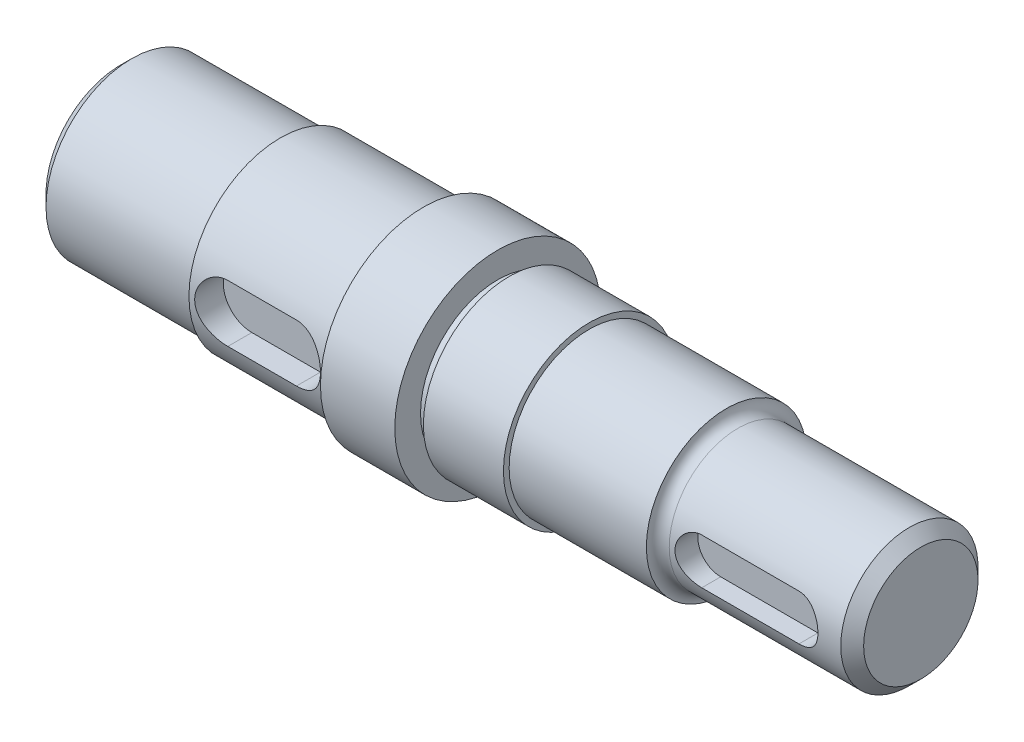
ISO-10303-21;
HEADER;
FILE_DESCRIPTION(('STEP AP214'),'2;1');
FILE_NAME('part.step','',(''),(''),'','','');
FILE_SCHEMA(('AUTOMOTIVE_DESIGN { 1 0 10303 214 1 1 1 1 }'));
ENDSEC;
DATA;
#1=APPLICATION_CONTEXT('core data for automotive mechanical design processes');
#2=APPLICATION_PROTOCOL_DEFINITION('international standard','automotive_design',2000,#1);
#3=PRODUCT_CONTEXT('',#1,'mechanical');
#4=PRODUCT('Part','Part','',(#3));
#5=PRODUCT_RELATED_PRODUCT_CATEGORY('part','',(#4));
#6=PRODUCT_DEFINITION_FORMATION('','',#4);
#7=PRODUCT_DEFINITION_CONTEXT('part definition',#1,'design');
#8=PRODUCT_DEFINITION('design','',#6,#7);
#9=PRODUCT_DEFINITION_SHAPE('','',#8);
#10=(LENGTH_UNIT() NAMED_UNIT(*) SI_UNIT(.MILLI.,.METRE.));
#11=(NAMED_UNIT(*) PLANE_ANGLE_UNIT() SI_UNIT($,.RADIAN.));
#12=(NAMED_UNIT(*) SI_UNIT($,.STERADIAN.) SOLID_ANGLE_UNIT());
#13=UNCERTAINTY_MEASURE_WITH_UNIT(LENGTH_MEASURE(1.E-05),#10,'distance_accuracy_value','');
#14=(GEOMETRIC_REPRESENTATION_CONTEXT(3) GLOBAL_UNCERTAINTY_ASSIGNED_CONTEXT((#13)) GLOBAL_UNIT_ASSIGNED_CONTEXT((#10,
#11,#12)) REPRESENTATION_CONTEXT('',''));
#15=CARTESIAN_POINT('',(0.,0.,0.));
#16=DIRECTION('',(0.,0.,1.));
#17=DIRECTION('',(1.,0.,0.));
#18=AXIS2_PLACEMENT_3D('',#15,#16,#17);
#19=CARTESIAN_POINT('',(0.,0.,0.));
#20=DIRECTION('',(1.,0.,0.));
#21=DIRECTION('',(0.,0.,-1.));
#22=AXIS2_PLACEMENT_3D('',#19,#20,#21);
#23=PLANE('',#22);
#24=CARTESIAN_POINT('',(0.,0.,0.));
#25=DIRECTION('',(1.,0.,0.));
#26=DIRECTION('',(0.,0.,-1.));
#27=AXIS2_PLACEMENT_3D('',#24,#25,#26);
#28=CIRCLE('',#27,13.);
#29=CARTESIAN_POINT('',(0.,0.,-13.));
#30=VERTEX_POINT('',#29);
#31=EDGE_CURVE('E294',#30,#30,#28,.F.);
#32=ORIENTED_EDGE('',*,*,#31,.T.);
#33=EDGE_LOOP('',(#32));
#34=FACE_BOUND('',#33,.T.);
#35=ADVANCED_FACE('F45',(#34),#23,.F.);
#36=CARTESIAN_POINT('',(0.,0.,0.));
#37=DIRECTION('',(-1.,0.,0.));
#38=DIRECTION('',(0.,0.,1.));
#39=AXIS2_PLACEMENT_3D('',#36,#37,#38);
#40=CYLINDRICAL_SURFACE('',#39,15.);
#41=CARTESIAN_POINT('',(2.00000000000004,0.,0.));
#42=DIRECTION('',(1.,0.,0.));
#43=DIRECTION('',(0.,0.,-1.));
#44=AXIS2_PLACEMENT_3D('',#41,#42,#43);
#45=CIRCLE('',#44,15.);
#46=CARTESIAN_POINT('',(2.00000000000004,0.,-15.));
#47=VERTEX_POINT('',#46);
#48=EDGE_CURVE('E298',#47,#47,#45,.T.);
#49=ORIENTED_EDGE('',*,*,#48,.T.);
#50=EDGE_LOOP('',(#49));
#51=FACE_BOUND('',#50,.T.);
#52=CARTESIAN_POINT('',(28.,0.,0.));
#53=DIRECTION('',(-1.,0.,0.));
#54=DIRECTION('',(0.,0.,1.));
#55=AXIS2_PLACEMENT_3D('',#52,#53,#54);
#56=CIRCLE('',#55,15.);
#57=CARTESIAN_POINT('',(28.,0.,15.));
#58=VERTEX_POINT('',#57);
#59=EDGE_CURVE('E208',#58,#58,#56,.T.);
#60=ORIENTED_EDGE('',*,*,#59,.T.);
#61=EDGE_LOOP('',(#60));
#62=FACE_BOUND('',#61,.T.);
#63=ADVANCED_FACE('F387',(#51,#62),#40,.T.);
#64=CARTESIAN_POINT('',(28.,15.,0.));
#65=DIRECTION('',(1.,0.,0.));
#66=DIRECTION('',(0.,0.,-1.));
#67=AXIS2_PLACEMENT_3D('',#64,#65,#66);
#68=PLANE('',#67);
#69=ORIENTED_EDGE('',*,*,#59,.F.);
#70=EDGE_LOOP('',(#69));
#71=FACE_BOUND('',#70,.T.);
#72=CARTESIAN_POINT('',(28.,0.,0.));
#73=DIRECTION('',(-1.,0.,0.));
#74=DIRECTION('',(0.,0.,1.));
#75=AXIS2_PLACEMENT_3D('',#72,#73,#74);
#76=CIRCLE('',#75,16.);
#77=CARTESIAN_POINT('',(28.,0.,16.));
#78=VERTEX_POINT('',#77);
#79=EDGE_CURVE('E204',#78,#78,#76,.T.);
#80=ORIENTED_EDGE('',*,*,#79,.T.);
#81=EDGE_LOOP('',(#80));
#82=FACE_BOUND('',#81,.T.);
#83=ADVANCED_FACE('F393',(#71,#82),#68,.F.);
#84=CARTESIAN_POINT('',(0.,0.,0.));
#85=DIRECTION('',(-1.,0.,0.));
#86=DIRECTION('',(0.,0.,1.));
#87=AXIS2_PLACEMENT_3D('',#84,#85,#86);
#88=CYLINDRICAL_SURFACE('',#87,16.);
#89=DIRECTION('',(-1.,0.,0.));
#90=VECTOR('',#89,1.);
#91=CARTESIAN_POINT('',(0.,-5.,15.1986841535707));
#92=LINE('',#91,#90);
#93=CARTESIAN_POINT('',(46.,-5.,15.1986841535706));
#94=VERTEX_POINT('',#93);
#95=CARTESIAN_POINT('',(34.,-5.,15.1986841535707));
#96=VERTEX_POINT('',#95);
#97=EDGE_CURVE('E130',#94,#96,#92,.T.);
#98=ORIENTED_EDGE('',*,*,#97,.T.);
#99=CARTESIAN_POINT('',(34.,-5.,15.1986841535707));
#100=CARTESIAN_POINT('',(33.8630702822621,-5.00001876402018,15.1986635060155));
#101=CARTESIAN_POINT('',(33.7261484213893,-4.99437589347759,15.2005339376472));
#102=CARTESIAN_POINT('',(33.4533558383189,-4.9719066012981,15.2079058985265));
#103=CARTESIAN_POINT('',(33.317484870769,-4.95508287500205,15.2134065526432));
#104=CARTESIAN_POINT('',(33.0481243746701,-4.91045141983463,15.2278686056186));
#105=CARTESIAN_POINT('',(32.9146294347407,-4.88267328245064,15.2368206796073));
#106=CARTESIAN_POINT('',(32.6505878086342,-4.81639022533697,15.2579029145887));
#107=CARTESIAN_POINT('',(32.520041210219,-4.77788498675235,15.2700331700498));
#108=CARTESIAN_POINT('',(32.2628612643995,-4.69049837729811,15.2971014107057));
#109=CARTESIAN_POINT('',(32.1362253650484,-4.64162394412445,15.3120375178334));
#110=CARTESIAN_POINT('',(31.8875769745497,-4.5338788859812,15.3442856115609));
#111=CARTESIAN_POINT('',(31.7655662261565,-4.47500453795589,15.3615984825888));
#112=CARTESIAN_POINT('',(31.4076109320201,-4.28398711580932,15.4163884767029));
#113=CARTESIAN_POINT('',(31.1796083142096,-4.13740351463561,15.4567319869187));
#114=CARTESIAN_POINT('',(30.7440479172172,-3.80477014396879,15.5420083062615));
#115=CARTESIAN_POINT('',(30.5373414917238,-3.61763914961479,15.5870445200358));
#116=CARTESIAN_POINT('',(30.1576323473106,-3.21145982301368,15.6757673694125));
#117=CARTESIAN_POINT('',(29.9846354272766,-2.99240601054465,15.7194537717275));
#118=CARTESIAN_POINT('',(29.6735496021778,-2.52249761762139,15.8017432610087));
#119=CARTESIAN_POINT('',(29.5363388732035,-2.27103576512449,15.8402090039263));
#120=CARTESIAN_POINT('',(29.3064928618221,-1.74720631304677,15.9065031203034));
#121=CARTESIAN_POINT('',(29.2138453184526,-1.47484448775403,15.9343344192537));
#122=CARTESIAN_POINT('',(29.078595976993,-0.925860089211058,15.9754868433124));
#123=CARTESIAN_POINT('',(29.0345378909618,-0.649628435012783,15.989229278753));
#124=CARTESIAN_POINT('',(28.9931025685312,-0.0933690149137269,16.0021438524195));
#125=CARTESIAN_POINT('',(28.9957156674186,0.186657953048518,16.0013190072522));
#126=CARTESIAN_POINT('',(29.0465934760002,0.732299589546373,15.9854845726588));
#127=CARTESIAN_POINT('',(29.0932787302122,0.998078033880897,15.9709657627342));
#128=CARTESIAN_POINT('',(29.2283803171704,1.5178147316323,15.9299791073477));
#129=CARTESIAN_POINT('',(29.3167988934806,1.77177234876052,15.90351061948));
#130=CARTESIAN_POINT('',(29.5338838261577,2.26431537219271,15.8409378140145));
#131=CARTESIAN_POINT('',(29.6630299628918,2.50267435181535,15.8047194262738));
#132=CARTESIAN_POINT('',(29.9574767783085,2.95480608942298,15.7264700104951));
#133=CARTESIAN_POINT('',(30.1227862195434,3.16857286940455,15.6844375745929));
#134=CARTESIAN_POINT('',(30.4931136677204,3.57495597883694,15.5969449434458));
#135=CARTESIAN_POINT('',(30.6994970743712,3.76632311133058,15.5514148920094));
#136=CARTESIAN_POINT('',(31.0310256265811,4.0255398962626,15.4855747041344));
#137=CARTESIAN_POINT('',(31.1452803226717,4.10735324144971,15.464023127535));
#138=CARTESIAN_POINT('',(31.3804385781784,4.26117389729569,15.4223452821405));
#139=CARTESIAN_POINT('',(31.5013395150757,4.33318503733555,15.4022184582275));
#140=CARTESIAN_POINT('',(31.7505332253631,4.46768370741089,15.3637482945825));
#141=CARTESIAN_POINT('',(31.8788980184553,4.53004475183006,15.3454296242414));
#142=CARTESIAN_POINT('',(32.1407366018309,4.64365087484838,15.3114343470153));
#143=CARTESIAN_POINT('',(32.2742082620061,4.69490052987992,15.2957566529907));
#144=CARTESIAN_POINT('',(32.5452079181555,4.78581076137361,15.2675565411669));
#145=CARTESIAN_POINT('',(32.6827314263573,4.82548366541208,15.2550307689955));
#146=CARTESIAN_POINT('',(32.960881366584,4.89292357731495,15.2335336556112));
#147=CARTESIAN_POINT('',(33.1015063415504,4.92069605575214,15.2245606813372));
#148=CARTESIAN_POINT('',(33.3683130663014,4.96155201839676,15.2112927618778));
#149=CARTESIAN_POINT('',(33.4942713191738,4.97596872830391,15.2065749583153));
#150=CARTESIAN_POINT('',(33.7468165151434,4.99519230047639,15.2002655216957));
#151=CARTESIAN_POINT('',(33.8734023162775,5.00001273345967,15.1986694740171));
#152=CARTESIAN_POINT('',(34.,5.,15.1986841535707));
#153=B_SPLINE_CURVE_WITH_KNOTS('',3,(#99,#100,#101,#102,#103,#104,#105,#106,#107,#108,#109,#110,
#111,#112,#113,#114,#115,#116,#117,#118,#119,#120,#121,#122,#123,#124,#125,#126,#127,#128,#129,
#130,#131,#132,#133,#134,#135,#136,#137,#138,#139,#140,#141,#142,#143,#144,#145,#146,#147,#148,
#149,#150,#151,#152),.UNSPECIFIED.,.F.,.F.,(4,2,2,2,2,2,2,2,2,2,2,2,2,2,2,2,2,2,2,2,2,2,2,2,2,2,
4),(0.,0.410647919758036,0.821196881542661,1.23064432922751,1.6401039487254,2.04929047101912,
2.45862967230993,3.27688279131029,4.12046514534439,4.96419248897057,5.82700574327197,
6.68958147010308,7.5255360051732,8.36131743199137,9.16823951381224,9.97520498033129,
10.7920560572179,11.609105280929,12.4601312020614,12.8862315051731,13.3121648650027,
13.7432787284905,14.174214690975,14.604690079864,15.0349673682784,15.4151752920152,
15.7948451560185),.UNSPECIFIED.);
#154=CARTESIAN_POINT('',(34.,5.,15.1986841535706));
#155=VERTEX_POINT('',#154);
#156=EDGE_CURVE('E286',#96,#155,#153,.T.);
#157=ORIENTED_EDGE('',*,*,#156,.T.);
#158=DIRECTION('',(-1.,0.,0.));
#159=VECTOR('',#158,1.);
#160=CARTESIAN_POINT('',(0.,5.,15.1986841535707));
#161=LINE('',#160,#159);
#162=CARTESIAN_POINT('',(46.,5.,15.1986841535707));
#163=VERTEX_POINT('',#162);
#164=EDGE_CURVE('E268',#155,#163,#161,.F.);
#165=ORIENTED_EDGE('',*,*,#164,.T.);
#166=CARTESIAN_POINT('',(46.,5.,15.1986841535707));
#167=CARTESIAN_POINT('',(46.1369297177379,5.00001876402018,15.1986635060155));
#168=CARTESIAN_POINT('',(46.2738515786107,4.99437589347759,15.2005339376472));
#169=CARTESIAN_POINT('',(46.5466441616812,4.9719066012981,15.2079058985265));
#170=CARTESIAN_POINT('',(46.6825151292311,4.95508287500205,15.2134065526432));
#171=CARTESIAN_POINT('',(46.95187562533,4.91045141983463,15.2278686056186));
#172=CARTESIAN_POINT('',(47.0853705652593,4.88267328245064,15.2368206796073));
#173=CARTESIAN_POINT('',(47.3494121913658,4.81639022533697,15.2579029145887));
#174=CARTESIAN_POINT('',(47.479958789781,4.77788498675235,15.2700331700498));
#175=CARTESIAN_POINT('',(47.7371387356005,4.6904983772981,15.2971014107057));
#176=CARTESIAN_POINT('',(47.8637746349516,4.64162394412444,15.3120375178334));
#177=CARTESIAN_POINT('',(48.1124230254503,4.53387888598119,15.3442856115609));
#178=CARTESIAN_POINT('',(48.2344337738436,4.47500453795589,15.3615984825888));
#179=CARTESIAN_POINT('',(48.5923890679799,4.28398711580932,15.4163884767029));
#180=CARTESIAN_POINT('',(48.8203916857905,4.13740351463561,15.4567319869187));
#181=CARTESIAN_POINT('',(49.2559520827829,3.80477014396878,15.5420083062615));
#182=CARTESIAN_POINT('',(49.4626585082763,3.61763914961478,15.5870445200358));
#183=CARTESIAN_POINT('',(49.8423676526895,3.21145982301367,15.6757673694125));
#184=CARTESIAN_POINT('',(50.0153645727234,2.99240601054464,15.7194537717275));
#185=CARTESIAN_POINT('',(50.3264503978223,2.52249761762139,15.8017432610087));
#186=CARTESIAN_POINT('',(50.4636611267965,2.27103576512448,15.8402090039263));
#187=CARTESIAN_POINT('',(50.6935071381779,1.74720631304676,15.9065031203034));
#188=CARTESIAN_POINT('',(50.7861546815474,1.47484448775402,15.9343344192537));
#189=CARTESIAN_POINT('',(50.9214040230071,0.925860089211045,15.9754868433124));
#190=CARTESIAN_POINT('',(50.9654621090383,0.64962843501277,15.989229278753));
#191=CARTESIAN_POINT('',(51.0068974314688,0.093369014913714,16.0021438524195));
#192=CARTESIAN_POINT('',(51.0042843325814,-0.18665795304853,16.0013190072522));
#193=CARTESIAN_POINT('',(50.9534065239999,-0.732299589546384,15.9854845726588));
#194=CARTESIAN_POINT('',(50.9067212697879,-0.998078033880907,15.9709657627342));
#195=CARTESIAN_POINT('',(50.7716196828297,-1.51781473163231,15.9299791073477));
#196=CARTESIAN_POINT('',(50.6832011065195,-1.77177234876053,15.90351061948));
#197=CARTESIAN_POINT('',(50.4661161738423,-2.26431537219272,15.8409378140145));
#198=CARTESIAN_POINT('',(50.3369700371082,-2.50267435181537,15.8047194262738));
#199=CARTESIAN_POINT('',(50.0425232216915,-2.954806089423,15.7264700104951));
#200=CARTESIAN_POINT('',(49.8772137804566,-3.16857286940456,15.6844375745929));
#201=CARTESIAN_POINT('',(49.5068863322796,-3.57495597883695,15.5969449434458));
#202=CARTESIAN_POINT('',(49.3005029256289,-3.76632311133059,15.5514148920094));
#203=CARTESIAN_POINT('',(48.9689743734189,-4.02553989626261,15.4855747041344));
#204=CARTESIAN_POINT('',(48.8547196773284,-4.10735324144972,15.464023127535));
#205=CARTESIAN_POINT('',(48.6195614218216,-4.2611738972957,15.4223452821405));
#206=CARTESIAN_POINT('',(48.4986604849244,-4.33318503733556,15.4022184582275));
#207=CARTESIAN_POINT('',(48.249466774637,-4.4676837074109,15.3637482945824));
#208=CARTESIAN_POINT('',(48.1211019815448,-4.53004475183006,15.3454296242414));
#209=CARTESIAN_POINT('',(47.8592633981691,-4.64365087484839,15.3114343470153));
#210=CARTESIAN_POINT('',(47.7257917379939,-4.69490052987993,15.2957566529907));
#211=CARTESIAN_POINT('',(47.4547920818445,-4.78581076137361,15.2675565411669));
#212=CARTESIAN_POINT('',(47.3172685736427,-4.82548366541208,15.2550307689955));
#213=CARTESIAN_POINT('',(47.039118633416,-4.89292357731495,15.2335336556112));
#214=CARTESIAN_POINT('',(46.8984936584496,-4.92069605575214,15.2245606813372));
#215=CARTESIAN_POINT('',(46.6316869336987,-4.96155201839676,15.2112927618778));
#216=CARTESIAN_POINT('',(46.5057286808263,-4.97596872830391,15.2065749583153));
#217=CARTESIAN_POINT('',(46.2531834848566,-4.99519230047639,15.2002655216957));
#218=CARTESIAN_POINT('',(46.1265976837226,-5.00001273345967,15.1986694740171));
#219=CARTESIAN_POINT('',(46.,-5.,15.1986841535707));
#220=B_SPLINE_CURVE_WITH_KNOTS('',3,(#166,#167,#168,#169,#170,#171,#172,#173,#174,#175,#176,
#177,#178,#179,#180,#181,#182,#183,#184,#185,#186,#187,#188,#189,#190,#191,#192,#193,#194,#195,
#196,#197,#198,#199,#200,#201,#202,#203,#204,#205,#206,#207,#208,#209,#210,#211,#212,#213,#214,
#215,#216,#217,#218,#219),.UNSPECIFIED.,.F.,.F.,(4,2,2,2,2,2,2,2,2,2,2,2,2,2,2,2,2,2,2,2,2,2,2,
2,2,2,4),(0.,0.410647919758036,0.821196881542661,1.23064432922751,1.64010394872541,
2.04929047101912,2.45862967230994,3.2768827913103,4.1204651453444,4.96419248897057,
5.82700574327198,6.6895814701031,7.52553600517322,8.36131743199138,9.16823951381225,
9.97520498033131,10.7920560572179,11.609105280929,12.4601312020614,12.8862315051731,
13.3121648650028,13.7432787284905,14.1742146909751,14.6046900798641,15.0349673682784,
15.4151752920152,15.7948451560185),.UNSPECIFIED.);
#221=EDGE_CURVE('E259',#163,#94,#220,.T.);
#222=ORIENTED_EDGE('',*,*,#221,.T.);
#223=EDGE_LOOP('',(#98,#157,#165,#222));
#224=FACE_BOUND('',#223,.T.);
#225=ORIENTED_EDGE('',*,*,#79,.F.);
#226=EDGE_LOOP('',(#225));
#227=FACE_BOUND('',#226,.T.);
#228=CARTESIAN_POINT('',(53.,0.,0.));
#229=DIRECTION('',(-1.,0.,0.));
#230=DIRECTION('',(0.,0.,1.));
#231=AXIS2_PLACEMENT_3D('',#228,#229,#230);
#232=CIRCLE('',#231,16.);
#233=CARTESIAN_POINT('',(53.,0.,16.));
#234=VERTEX_POINT('',#233);
#235=EDGE_CURVE('E200',#234,#234,#232,.T.);
#236=ORIENTED_EDGE('',*,*,#235,.T.);
#237=EDGE_LOOP('',(#236));
#238=FACE_BOUND('',#237,.T.);
#239=ADVANCED_FACE('F270',(#224,#227,#238),#88,.T.);
#240=CARTESIAN_POINT('',(53.,16.,0.));
#241=DIRECTION('',(1.,0.,0.));
#242=DIRECTION('',(0.,0.,-1.));
#243=AXIS2_PLACEMENT_3D('',#240,#241,#242);
#244=PLANE('',#243);
#245=ORIENTED_EDGE('',*,*,#235,.F.);
#246=EDGE_LOOP('',(#245));
#247=FACE_BOUND('',#246,.T.);
#248=CARTESIAN_POINT('',(53.,0.,0.));
#249=DIRECTION('',(-1.,0.,0.));
#250=DIRECTION('',(0.,0.,1.));
#251=AXIS2_PLACEMENT_3D('',#248,#249,#250);
#252=CIRCLE('',#251,18.);
#253=CARTESIAN_POINT('',(53.,0.,18.));
#254=VERTEX_POINT('',#253);
#255=EDGE_CURVE('E196',#254,#254,#252,.T.);
#256=ORIENTED_EDGE('',*,*,#255,.T.);
#257=EDGE_LOOP('',(#256));
#258=FACE_BOUND('',#257,.T.);
#259=ADVANCED_FACE('F413',(#247,#258),#244,.F.);
#260=CARTESIAN_POINT('',(0.,0.,0.));
#261=DIRECTION('',(-1.,0.,0.));
#262=DIRECTION('',(0.,0.,1.));
#263=AXIS2_PLACEMENT_3D('',#260,#261,#262);
#264=CYLINDRICAL_SURFACE('',#263,18.);
#265=ORIENTED_EDGE('',*,*,#255,.F.);
#266=EDGE_LOOP('',(#265));
#267=FACE_BOUND('',#266,.T.);
#268=CARTESIAN_POINT('',(66.,0.,0.));
#269=DIRECTION('',(-1.,0.,0.));
#270=DIRECTION('',(0.,0.,1.));
#271=AXIS2_PLACEMENT_3D('',#268,#269,#270);
#272=CIRCLE('',#271,18.);
#273=CARTESIAN_POINT('',(66.,0.,18.));
#274=VERTEX_POINT('',#273);
#275=EDGE_CURVE('E192',#274,#274,#272,.T.);
#276=ORIENTED_EDGE('',*,*,#275,.T.);
#277=EDGE_LOOP('',(#276));
#278=FACE_BOUND('',#277,.T.);
#279=ADVANCED_FACE('F418',(#267,#278),#264,.T.);
#280=CARTESIAN_POINT('',(66.,18.,0.));
#281=DIRECTION('',(-1.,0.,0.));
#282=DIRECTION('',(0.,0.,1.));
#283=AXIS2_PLACEMENT_3D('',#280,#281,#282);
#284=PLANE('',#283);
#285=ORIENTED_EDGE('',*,*,#275,.F.);
#286=EDGE_LOOP('',(#285));
#287=FACE_BOUND('',#286,.T.);
#288=CARTESIAN_POINT('',(66.,0.,0.));
#289=DIRECTION('',(-1.,0.,0.));
#290=DIRECTION('',(0.,0.,1.));
#291=AXIS2_PLACEMENT_3D('',#288,#289,#290);
#292=CIRCLE('',#291,13.5);
#293=CARTESIAN_POINT('',(66.,0.,13.5));
#294=VERTEX_POINT('',#293);
#295=EDGE_CURVE('E188',#294,#294,#292,.T.);
#296=ORIENTED_EDGE('',*,*,#295,.T.);
#297=EDGE_LOOP('',(#296));
#298=FACE_BOUND('',#297,.T.);
#299=ADVANCED_FACE('F423',(#287,#298),#284,.F.);
#300=CARTESIAN_POINT('',(0.,0.,0.));
#301=DIRECTION('',(-1.,0.,0.));
#302=DIRECTION('',(0.,0.,1.));
#303=AXIS2_PLACEMENT_3D('',#300,#301,#302);
#304=CYLINDRICAL_SURFACE('',#303,13.5);
#305=ORIENTED_EDGE('',*,*,#295,.F.);
#306=EDGE_LOOP('',(#305));
#307=FACE_BOUND('',#306,.T.);
#308=CARTESIAN_POINT('',(68.,0.,0.));
#309=DIRECTION('',(-1.,0.,0.));
#310=DIRECTION('',(0.,0.,1.));
#311=AXIS2_PLACEMENT_3D('',#308,#309,#310);
#312=CIRCLE('',#311,13.5);
#313=CARTESIAN_POINT('',(68.,0.,13.5));
#314=VERTEX_POINT('',#313);
#315=EDGE_CURVE('E184',#314,#314,#312,.T.);
#316=ORIENTED_EDGE('',*,*,#315,.T.);
#317=EDGE_LOOP('',(#316));
#318=FACE_BOUND('',#317,.T.);
#319=ADVANCED_FACE('F429',(#307,#318),#304,.T.);
#320=CARTESIAN_POINT('',(68.,13.5,0.));
#321=DIRECTION('',(1.,0.,0.));
#322=DIRECTION('',(0.,0.,-1.));
#323=AXIS2_PLACEMENT_3D('',#320,#321,#322);
#324=PLANE('',#323);
#325=ORIENTED_EDGE('',*,*,#315,.F.);
#326=EDGE_LOOP('',(#325));
#327=FACE_BOUND('',#326,.T.);
#328=CARTESIAN_POINT('',(68.,0.,0.));
#329=DIRECTION('',(-1.,0.,0.));
#330=DIRECTION('',(0.,0.,1.));
#331=AXIS2_PLACEMENT_3D('',#328,#329,#330);
#332=CIRCLE('',#331,15.);
#333=CARTESIAN_POINT('',(68.,0.,15.));
#334=VERTEX_POINT('',#333);
#335=EDGE_CURVE('E180',#334,#334,#332,.T.);
#336=ORIENTED_EDGE('',*,*,#335,.T.);
#337=EDGE_LOOP('',(#336));
#338=FACE_BOUND('',#337,.T.);
#339=ADVANCED_FACE('F435',(#327,#338),#324,.F.);
#340=CARTESIAN_POINT('',(0.,0.,0.));
#341=DIRECTION('',(-1.,0.,0.));
#342=DIRECTION('',(0.,0.,1.));
#343=AXIS2_PLACEMENT_3D('',#340,#341,#342);
#344=CYLINDRICAL_SURFACE('',#343,15.);
#345=ORIENTED_EDGE('',*,*,#335,.F.);
#346=EDGE_LOOP('',(#345));
#347=FACE_BOUND('',#346,.T.);
#348=CARTESIAN_POINT('',(82.,0.,0.));
#349=DIRECTION('',(-1.,0.,0.));
#350=DIRECTION('',(0.,0.,1.));
#351=AXIS2_PLACEMENT_3D('',#348,#349,#350);
#352=CIRCLE('',#351,15.);
#353=CARTESIAN_POINT('',(82.,0.,15.));
#354=VERTEX_POINT('',#353);
#355=EDGE_CURVE('E176',#354,#354,#352,.T.);
#356=ORIENTED_EDGE('',*,*,#355,.T.);
#357=EDGE_LOOP('',(#356));
#358=FACE_BOUND('',#357,.T.);
#359=ADVANCED_FACE('F441',(#347,#358),#344,.T.);
#360=CARTESIAN_POINT('',(82.,15.,0.));
#361=DIRECTION('',(-1.,0.,0.));
#362=DIRECTION('',(0.,0.,1.));
#363=AXIS2_PLACEMENT_3D('',#360,#361,#362);
#364=PLANE('',#363);
#365=ORIENTED_EDGE('',*,*,#355,.F.);
#366=EDGE_LOOP('',(#365));
#367=FACE_BOUND('',#366,.T.);
#368=CARTESIAN_POINT('',(82.,0.,0.));
#369=DIRECTION('',(-1.,0.,0.));
#370=DIRECTION('',(0.,0.,1.));
#371=AXIS2_PLACEMENT_3D('',#368,#369,#370);
#372=CIRCLE('',#371,14.);
#373=CARTESIAN_POINT('',(82.,0.,14.));
#374=VERTEX_POINT('',#373);
#375=EDGE_CURVE('E172',#374,#374,#372,.T.);
#376=ORIENTED_EDGE('',*,*,#375,.T.);
#377=EDGE_LOOP('',(#376));
#378=FACE_BOUND('',#377,.T.);
#379=ADVANCED_FACE('F447',(#367,#378),#364,.F.);
#380=CARTESIAN_POINT('',(0.,0.,0.));
#381=DIRECTION('',(-1.,0.,0.));
#382=DIRECTION('',(0.,0.,1.));
#383=AXIS2_PLACEMENT_3D('',#380,#381,#382);
#384=CYLINDRICAL_SURFACE('',#383,14.);
#385=ORIENTED_EDGE('',*,*,#375,.F.);
#386=EDGE_LOOP('',(#385));
#387=FACE_BOUND('',#386,.T.);
#388=CARTESIAN_POINT('',(106.,0.,0.));
#389=DIRECTION('',(-1.,0.,0.));
#390=DIRECTION('',(0.,0.,1.));
#391=AXIS2_PLACEMENT_3D('',#388,#389,#390);
#392=CIRCLE('',#391,14.);
#393=CARTESIAN_POINT('',(106.,0.,14.));
#394=VERTEX_POINT('',#393);
#395=EDGE_CURVE('E168',#394,#394,#392,.T.);
#396=ORIENTED_EDGE('',*,*,#395,.T.);
#397=EDGE_LOOP('',(#396));
#398=FACE_BOUND('',#397,.T.);
#399=ADVANCED_FACE('F319',(#387,#398),#384,.T.);
#400=CARTESIAN_POINT('',(0.,0.,0.));
#401=DIRECTION('',(-1.,0.,0.));
#402=DIRECTION('',(0.,0.,1.));
#403=AXIS2_PLACEMENT_3D('',#400,#401,#402);
#404=CYLINDRICAL_SURFACE('',#403,12.);
#405=CARTESIAN_POINT('',(108.,0.,0.));
#406=DIRECTION('',(-1.,0.,0.));
#407=DIRECTION('',(0.,0.,1.));
#408=AXIS2_PLACEMENT_3D('',#405,#406,#407);
#409=CIRCLE('',#408,12.);
#410=CARTESIAN_POINT('',(108.,0.,12.));
#411=VERTEX_POINT('',#410);
#412=EDGE_CURVE('E12',#411,#411,#409,.F.);
#413=ORIENTED_EDGE('',*,*,#412,.T.);
#414=EDGE_LOOP('',(#413));
#415=FACE_BOUND('',#414,.T.);
#416=CARTESIAN_POINT('',(138.,0.,0.));
#417=DIRECTION('',(-1.,0.,0.));
#418=DIRECTION('',(0.,0.,1.));
#419=AXIS2_PLACEMENT_3D('',#416,#417,#418);
#420=CIRCLE('',#419,12.);
#421=CARTESIAN_POINT('',(138.,0.,12.));
#422=VERTEX_POINT('',#421);
#423=EDGE_CURVE('E302',#422,#422,#420,.T.);
#424=ORIENTED_EDGE('',*,*,#423,.T.);
#425=EDGE_LOOP('',(#424));
#426=FACE_BOUND('',#425,.T.);
#427=DIRECTION('',(-1.,0.,0.));
#428=VECTOR('',#427,1.);
#429=CARTESIAN_POINT('',(0.,-4.0000000000001,11.3137084989847));
#430=LINE('',#429,#428);
#431=CARTESIAN_POINT('',(130.,-3.99999999999999,11.3137084989847));
#432=VERTEX_POINT('',#431);
#433=CARTESIAN_POINT('',(113.,-4.0000000000001,11.3137084989847));
#434=VERTEX_POINT('',#433);
#435=EDGE_CURVE('E212',#432,#434,#430,.T.);
#436=ORIENTED_EDGE('',*,*,#435,.T.);
#437=CARTESIAN_POINT('',(113.,-4.00000000000001,11.3137084989848));
#438=CARTESIAN_POINT('',(112.890868675487,-4.00001438576651,11.3136910923705));
#439=CARTESIAN_POINT('',(112.781747080519,-3.99553419554537,11.3152871024731));
#440=CARTESIAN_POINT('',(112.564350338641,-3.97769673248753,11.3215763859361));
#441=CARTESIAN_POINT('',(112.456074971219,-3.96434185595522,11.3262688232103));
#442=CARTESIAN_POINT('',(112.241455218633,-3.92891935076474,11.3386032840401));
#443=CARTESIAN_POINT('',(112.135106075919,-3.90687756421022,11.3462365576019));
#444=CARTESIAN_POINT('',(111.924786770268,-3.85430689648188,11.364201918496));
#445=CARTESIAN_POINT('',(111.820816693457,-3.82377770857634,11.3745341033652));
#446=CARTESIAN_POINT('',(111.513661472456,-3.71986482089948,11.4091190527027));
#447=CARTESIAN_POINT('',(111.314913348044,-3.63410266896587,11.4369799021453));
#448=CARTESIAN_POINT('',(110.934597101663,-3.43228454569821,11.4991525453998));
#449=CARTESIAN_POINT('',(110.753039622767,-3.31620997228937,11.5334682968154));
#450=CARTESIAN_POINT('',(110.405131354431,-3.05220793355649,11.6061789182336));
#451=CARTESIAN_POINT('',(110.239543771511,-2.90330055412141,11.6446750308563));
#452=CARTESIAN_POINT('',(109.935172634886,-2.57995313902011,11.7205540276094));
#453=CARTESIAN_POINT('',(109.796393854115,-2.40550856651356,11.7579367125094));
#454=CARTESIAN_POINT('',(109.546082840949,-2.03041476001126,11.8285552975691));
#455=CARTESIAN_POINT('',(109.435356306739,-1.82920040495823,11.8616574966305));
#456=CARTESIAN_POINT('',(109.249630748978,-1.40971695235372,11.9187843500282));
#457=CARTESIAN_POINT('',(109.174620811381,-1.19145308844236,11.9428117769099));
#458=CARTESIAN_POINT('',(109.065057154839,-0.752117395358864,11.9783628445804));
#459=CARTESIAN_POINT('',(109.029186914908,-0.531407346429905,11.9902923605184));
#460=CARTESIAN_POINT('',(108.994734800776,-0.0867958692352762,12.0017443351774));
#461=CARTESIAN_POINT('',(108.996144041613,0.13710478588682,12.0012697502156));
#462=CARTESIAN_POINT('',(109.035377095253,0.572415361032324,11.9882415502496));
#463=CARTESIAN_POINT('',(109.07177040133,0.783970739663763,11.9761624577266));
#464=CARTESIAN_POINT('',(109.177572945212,1.19777632834895,11.9418784019559));
#465=CARTESIAN_POINT('',(109.246984013727,1.40002602175551,11.9196728772387));
#466=CARTESIAN_POINT('',(109.41768490607,1.7926102253711,11.8670267992102));
#467=CARTESIAN_POINT('',(109.519382030606,1.98275302130578,11.8364817702071));
#468=CARTESIAN_POINT('',(109.751441956031,2.34369935797279,11.7703352504572));
#469=CARTESIAN_POINT('',(109.881812554588,2.51449761883745,11.7347323851811));
#470=CARTESIAN_POINT('',(110.174675792184,2.84038544309998,11.6602518814889));
#471=CARTESIAN_POINT('',(110.338390110299,2.99435951335509,11.6212989752184));
#472=CARTESIAN_POINT('',(110.689798033346,3.27310303719343,11.5458957896576));
#473=CARTESIAN_POINT('',(110.877499355,3.39786305574726,11.5094463215614));
#474=CARTESIAN_POINT('',(111.174712950377,3.56109757745216,11.4595759659792));
#475=CARTESIAN_POINT('',(111.277255404768,3.61182358389816,11.4436484943195));
#476=CARTESIAN_POINT('',(111.486564980956,3.70440095621128,11.4140167075143));
#477=CARTESIAN_POINT('',(111.593330322076,3.74625601636389,11.4003114674865));
#478=CARTESIAN_POINT('',(111.810217086566,3.82067426911566,11.3755873303494));
#479=CARTESIAN_POINT('',(111.920334713104,3.85324757051517,11.3645655126344));
#480=CARTESIAN_POINT('',(112.143168154447,3.90883841588792,11.3455648512893));
#481=CARTESIAN_POINT('',(112.255882757962,3.93186032329112,11.3375846182867));
#482=CARTESIAN_POINT('',(112.473642446551,3.96661962949784,11.3254693235584));
#483=CARTESIAN_POINT('',(112.578549519579,3.97913375141092,11.3210705251979));
#484=CARTESIAN_POINT('',(112.7889683327,3.99582494949883,11.3151843303776));
#485=CARTESIAN_POINT('',(112.894479115668,4.00001278362334,11.3136931771535));
#486=CARTESIAN_POINT('',(113.,4.00000000000001,11.3137084989848));
#487=B_SPLINE_CURVE_WITH_KNOTS('',3,(#437,#438,#439,#440,#441,#442,#443,#444,#445,#446,#447,
#448,#449,#450,#451,#452,#453,#454,#455,#456,#457,#458,#459,#460,#461,#462,#463,#464,#465,#466,
#467,#468,#469,#470,#471,#472,#473,#474,#475,#476,#477,#478,#479,#480,#481,#482,#483,#484,#485,
#486),.UNSPECIFIED.,.F.,.F.,(4,2,2,2,2,2,2,2,2,2,2,2,2,2,2,2,2,2,2,2,2,2,2,2,4),(0.,
0.327273938941734,0.654459544677852,0.980679087086539,1.30691042048863,1.95841627077209,
2.61032287944838,3.28524582541424,3.96028882145703,4.65295094423119,5.34540127175223,
6.01376445600326,6.68196834813284,7.32396236553655,7.96599198323706,8.61646637994585,
9.26711789045788,9.94834778922915,10.6297973968768,10.9759539762202,11.3219661149517,
11.6675999574416,12.0130757272824,12.3299368411189,12.6463882889711),.UNSPECIFIED.);
#488=CARTESIAN_POINT('',(113.,4.00000000000001,11.3137084989847));
#489=VERTEX_POINT('',#488);
#490=EDGE_CURVE('E249',#434,#489,#487,.T.);
#491=ORIENTED_EDGE('',*,*,#490,.T.);
#492=DIRECTION('',(-1.,0.,0.));
#493=VECTOR('',#492,1.);
#494=CARTESIAN_POINT('',(0.,4.0000000000001,11.3137084989847));
#495=LINE('',#494,#493);
#496=CARTESIAN_POINT('',(130.,3.99999999999999,11.3137084989848));
#497=VERTEX_POINT('',#496);
#498=EDGE_CURVE('E226',#489,#497,#495,.F.);
#499=ORIENTED_EDGE('',*,*,#498,.T.);
#500=CARTESIAN_POINT('',(130.,3.99999999999999,11.3137084989848));
#501=CARTESIAN_POINT('',(130.109131324513,4.00001438576649,11.3136910923705));
#502=CARTESIAN_POINT('',(130.218252919481,3.99553419554535,11.3152871024731));
#503=CARTESIAN_POINT('',(130.435649661359,3.97769673248751,11.3215763859361));
#504=CARTESIAN_POINT('',(130.543925028781,3.96434185595521,11.3262688232103));
#505=CARTESIAN_POINT('',(130.758544781367,3.92891935076473,11.3386032840401));
#506=CARTESIAN_POINT('',(130.864893924082,3.9068775642102,11.3462365576019));
#507=CARTESIAN_POINT('',(131.075213229732,3.85430689648187,11.364201918496));
#508=CARTESIAN_POINT('',(131.179183306543,3.82377770857633,11.3745341033652));
#509=CARTESIAN_POINT('',(131.486338527544,3.71986482089946,11.4091190527027));
#510=CARTESIAN_POINT('',(131.685086651956,3.63410266896586,11.4369799021453));
#511=CARTESIAN_POINT('',(132.065402898337,3.43228454569819,11.4991525453998));
#512=CARTESIAN_POINT('',(132.246960377233,3.31620997228935,11.5334682968154));
#513=CARTESIAN_POINT('',(132.594868645569,3.05220793355648,11.6061789182336));
#514=CARTESIAN_POINT('',(132.760456228489,2.9033005541214,11.6446750308563));
#515=CARTESIAN_POINT('',(133.064827365114,2.57995313902011,11.7205540276094));
#516=CARTESIAN_POINT('',(133.203606145885,2.40550856651357,11.7579367125094));
#517=CARTESIAN_POINT('',(133.453917159051,2.03041476001127,11.8285552975691));
#518=CARTESIAN_POINT('',(133.564643693261,1.82920040495825,11.8616574966305));
#519=CARTESIAN_POINT('',(133.750369251022,1.40971695235374,11.9187843500282));
#520=CARTESIAN_POINT('',(133.825379188619,1.19145308844236,11.9428117769099));
#521=CARTESIAN_POINT('',(133.934942845161,0.752117395358866,11.9783628445804));
#522=CARTESIAN_POINT('',(133.970813085092,0.531407346429908,11.9902923605184));
#523=CARTESIAN_POINT('',(134.005265199224,0.086795869235282,12.0017443351774));
#524=CARTESIAN_POINT('',(134.003855958387,-0.137104785886813,12.0012697502156));
#525=CARTESIAN_POINT('',(133.964622904747,-0.572415361032315,11.9882415502496));
#526=CARTESIAN_POINT('',(133.92822959867,-0.783970739663753,11.9761624577266));
#527=CARTESIAN_POINT('',(133.822427054788,-1.19777632834894,11.9418784019559));
#528=CARTESIAN_POINT('',(133.753015986273,-1.40002602175549,11.9196728772387));
#529=CARTESIAN_POINT('',(133.58231509393,-1.79261022537109,11.8670267992102));
#530=CARTESIAN_POINT('',(133.480617969394,-1.98275302130578,11.8364817702071));
#531=CARTESIAN_POINT('',(133.248558043969,-2.34369935797278,11.7703352504572));
#532=CARTESIAN_POINT('',(133.118187445412,-2.51449761883744,11.7347323851811));
#533=CARTESIAN_POINT('',(132.825324207816,-2.84038544309997,11.6602518814889));
#534=CARTESIAN_POINT('',(132.661609889701,-2.99435951335508,11.6212989752184));
#535=CARTESIAN_POINT('',(132.310201966654,-3.27310303719342,11.5458957896576));
#536=CARTESIAN_POINT('',(132.122500645,-3.39786305574724,11.5094463215614));
#537=CARTESIAN_POINT('',(131.825287049623,-3.56109757745214,11.4595759659792));
#538=CARTESIAN_POINT('',(131.722744595233,-3.61182358389813,11.4436484943195));
#539=CARTESIAN_POINT('',(131.513435019044,-3.70440095621126,11.4140167075143));
#540=CARTESIAN_POINT('',(131.406669677924,-3.74625601636387,11.4003114674865));
#541=CARTESIAN_POINT('',(131.189782913434,-3.82067426911564,11.3755873303494));
#542=CARTESIAN_POINT('',(131.079665286896,-3.85324757051515,11.3645655126344));
#543=CARTESIAN_POINT('',(130.856831845553,-3.90883841588791,11.3455648512893));
#544=CARTESIAN_POINT('',(130.744117242038,-3.93186032329111,11.3375846182867));
#545=CARTESIAN_POINT('',(130.526357553449,-3.96661962949783,11.3254693235584));
#546=CARTESIAN_POINT('',(130.421450480421,-3.97913375141091,11.3210705251979));
#547=CARTESIAN_POINT('',(130.2110316673,-3.99582494949882,11.3151843303776));
#548=CARTESIAN_POINT('',(130.105520884332,-4.00001278362332,11.3136931771535));
#549=CARTESIAN_POINT('',(130.,-3.99999999999999,11.3137084989848));
#550=B_SPLINE_CURVE_WITH_KNOTS('',3,(#500,#501,#502,#503,#504,#505,#506,#507,#508,#509,#510,
#511,#512,#513,#514,#515,#516,#517,#518,#519,#520,#521,#522,#523,#524,#525,#526,#527,#528,#529,
#530,#531,#532,#533,#534,#535,#536,#537,#538,#539,#540,#541,#542,#543,#544,#545,#546,#547,#548,
#549),.UNSPECIFIED.,.F.,.F.,(4,2,2,2,2,2,2,2,2,2,2,2,2,2,2,2,2,2,2,2,2,2,2,2,4),(0.,
0.327273938941734,0.654459544677866,0.980679087086552,1.30691042048862,1.95841627077209,
2.61032287944838,3.28524582541421,3.96028882145698,4.65295094423115,5.3454012717522,
6.01376445600323,6.68196834813281,7.32396236553652,7.96599198323703,8.61646637994583,
9.26711789045785,9.94834778922909,10.6297973968768,10.9759539762201,11.3219661149517,
11.6675999574416,12.0130757272824,12.3299368411189,12.6463882889711),.UNSPECIFIED.);
#551=EDGE_CURVE('E216',#497,#432,#550,.T.);
#552=ORIENTED_EDGE('',*,*,#551,.T.);
#553=EDGE_LOOP('',(#436,#491,#499,#552));
#554=FACE_BOUND('',#553,.T.);
#555=ADVANCED_FACE('F228',(#415,#426,#554),#404,.T.);
#556=CARTESIAN_POINT('',(140.,12.,0.));
#557=DIRECTION('',(-1.,0.,0.));
#558=DIRECTION('',(0.,0.,1.));
#559=AXIS2_PLACEMENT_3D('',#556,#557,#558);
#560=PLANE('',#559);
#561=CARTESIAN_POINT('',(140.,0.,0.));
#562=DIRECTION('',(-1.,0.,0.));
#563=DIRECTION('',(0.,0.,1.));
#564=AXIS2_PLACEMENT_3D('',#561,#562,#563);
#565=CIRCLE('',#564,9.99999999999999);
#566=CARTESIAN_POINT('',(140.,0.,9.99999999999999));
#567=VERTEX_POINT('',#566);
#568=EDGE_CURVE('E54',#567,#567,#565,.F.);
#569=ORIENTED_EDGE('',*,*,#568,.T.);
#570=EDGE_LOOP('',(#569));
#571=FACE_BOUND('',#570,.T.);
#572=ADVANCED_FACE('F247',(#571),#560,.F.);
#573=CARTESIAN_POINT('',(113.,0.,-26.2488094968134));
#574=DIRECTION('',(0.,0.,1.));
#575=DIRECTION('',(1.,0.,0.));
#576=AXIS2_PLACEMENT_3D('',#573,#574,#575);
#577=CYLINDRICAL_SURFACE('',#576,4.00000000000001);
#578=DIRECTION('',(0.,0.,1.));
#579=VECTOR('',#578,1.);
#580=CARTESIAN_POINT('',(113.,-4.00000000000001,-26.2488094968134));
#581=LINE('',#580,#579);
#582=CARTESIAN_POINT('',(113.,-4.00000000000001,8.));
#583=VERTEX_POINT('',#582);
#584=EDGE_CURVE('E69',#583,#434,#581,.T.);
#585=ORIENTED_EDGE('',*,*,#584,.F.);
#586=CARTESIAN_POINT('',(113.,0.,8.));
#587=DIRECTION('',(0.,0.,1.));
#588=DIRECTION('',(1.,0.,0.));
#589=AXIS2_PLACEMENT_3D('',#586,#587,#588);
#590=CIRCLE('',#589,4.00000000000001);
#591=CARTESIAN_POINT('',(113.,4.00000000000001,8.));
#592=VERTEX_POINT('',#591);
#593=EDGE_CURVE('E152',#583,#592,#590,.F.);
#594=ORIENTED_EDGE('',*,*,#593,.T.);
#595=DIRECTION('',(0.,0.,1.));
#596=VECTOR('',#595,1.);
#597=CARTESIAN_POINT('',(113.,4.00000000000001,-26.2488094968134));
#598=LINE('',#597,#596);
#599=EDGE_CURVE('E149',#592,#489,#598,.T.);
#600=ORIENTED_EDGE('',*,*,#599,.T.);
#601=ORIENTED_EDGE('',*,*,#490,.F.);
#602=EDGE_LOOP('',(#585,#594,#600,#601));
#603=FACE_BOUND('',#602,.T.);
#604=ADVANCED_FACE('F244',(#603),#577,.F.);
#605=CARTESIAN_POINT('',(113.,4.00000000000001,-26.2488094968134));
#606=DIRECTION('',(0.,1.,0.));
#607=DIRECTION('',(-1.,0.,0.));
#608=AXIS2_PLACEMENT_3D('',#605,#606,#607);
#609=PLANE('',#608);
#610=ORIENTED_EDGE('',*,*,#599,.F.);
#611=DIRECTION('',(1.,0.,0.));
#612=VECTOR('',#611,1.);
#613=CARTESIAN_POINT('',(113.,4.00000000000001,8.));
#614=LINE('',#613,#612);
#615=CARTESIAN_POINT('',(130.,3.99999999999999,8.));
#616=VERTEX_POINT('',#615);
#617=EDGE_CURVE('E148',#592,#616,#614,.T.);
#618=ORIENTED_EDGE('',*,*,#617,.T.);
#619=DIRECTION('',(0.,0.,1.));
#620=VECTOR('',#619,1.);
#621=CARTESIAN_POINT('',(130.,3.99999999999999,-26.2488094968134));
#622=LINE('',#621,#620);
#623=EDGE_CURVE('E159',#616,#497,#622,.T.);
#624=ORIENTED_EDGE('',*,*,#623,.T.);
#625=ORIENTED_EDGE('',*,*,#498,.F.);
#626=EDGE_LOOP('',(#610,#618,#624,#625));
#627=FACE_BOUND('',#626,.T.);
#628=ADVANCED_FACE('F238',(#627),#609,.F.);
#629=CARTESIAN_POINT('',(130.,0.,-26.2488094968134));
#630=DIRECTION('',(0.,0.,1.));
#631=DIRECTION('',(1.,0.,0.));
#632=AXIS2_PLACEMENT_3D('',#629,#630,#631);
#633=CYLINDRICAL_SURFACE('',#632,3.99999999999999);
#634=ORIENTED_EDGE('',*,*,#623,.F.);
#635=CARTESIAN_POINT('',(130.,0.,8.));
#636=DIRECTION('',(0.,0.,1.));
#637=DIRECTION('',(1.,0.,0.));
#638=AXIS2_PLACEMENT_3D('',#635,#636,#637);
#639=CIRCLE('',#638,3.99999999999999);
#640=CARTESIAN_POINT('',(130.,-3.99999999999999,8.));
#641=VERTEX_POINT('',#640);
#642=EDGE_CURVE('E145',#616,#641,#639,.F.);
#643=ORIENTED_EDGE('',*,*,#642,.T.);
#644=DIRECTION('',(0.,0.,1.));
#645=VECTOR('',#644,1.);
#646=CARTESIAN_POINT('',(130.,-3.99999999999999,-26.2488094968134));
#647=LINE('',#646,#645);
#648=EDGE_CURVE('E140',#641,#432,#647,.T.);
#649=ORIENTED_EDGE('',*,*,#648,.T.);
#650=ORIENTED_EDGE('',*,*,#551,.F.);
#651=EDGE_LOOP('',(#634,#643,#649,#650));
#652=FACE_BOUND('',#651,.T.);
#653=ADVANCED_FACE('F232',(#652),#633,.F.);
#654=CARTESIAN_POINT('',(113.,-4.00000000000001,-26.2488094968134));
#655=DIRECTION('',(0.,-1.,0.));
#656=DIRECTION('',(1.,0.,0.));
#657=AXIS2_PLACEMENT_3D('',#654,#655,#656);
#658=PLANE('',#657);
#659=ORIENTED_EDGE('',*,*,#648,.F.);
#660=DIRECTION('',(-1.,0.,0.));
#661=VECTOR('',#660,1.);
#662=CARTESIAN_POINT('',(113.,-4.00000000000001,8.));
#663=LINE('',#662,#661);
#664=EDGE_CURVE('E155',#641,#583,#663,.T.);
#665=ORIENTED_EDGE('',*,*,#664,.T.);
#666=ORIENTED_EDGE('',*,*,#584,.T.);
#667=ORIENTED_EDGE('',*,*,#435,.F.);
#668=EDGE_LOOP('',(#659,#665,#666,#667));
#669=FACE_BOUND('',#668,.T.);
#670=ADVANCED_FACE('F237',(#669),#658,.F.);
#671=CARTESIAN_POINT('',(0.,0.,8.));
#672=DIRECTION('',(0.,0.,1.));
#673=DIRECTION('',(1.,0.,0.));
#674=AXIS2_PLACEMENT_3D('',#671,#672,#673);
#675=PLANE('',#674);
#676=ORIENTED_EDGE('',*,*,#593,.F.);
#677=ORIENTED_EDGE('',*,*,#664,.F.);
#678=ORIENTED_EDGE('',*,*,#642,.F.);
#679=ORIENTED_EDGE('',*,*,#617,.F.);
#680=EDGE_LOOP('',(#676,#677,#678,#679));
#681=FACE_BOUND('',#680,.T.);
#682=ADVANCED_FACE('F243',(#681),#675,.T.);
#683=CARTESIAN_POINT('',(34.,0.,-24.1660919471891));
#684=DIRECTION('',(0.,0.,1.));
#685=DIRECTION('',(1.,0.,0.));
#686=AXIS2_PLACEMENT_3D('',#683,#684,#685);
#687=CYLINDRICAL_SURFACE('',#686,5.);
#688=DIRECTION('',(0.,0.,1.));
#689=VECTOR('',#688,1.);
#690=CARTESIAN_POINT('',(34.,-5.,-24.1660919471891));
#691=LINE('',#690,#689);
#692=CARTESIAN_POINT('',(34.,-5.,11.));
#693=VERTEX_POINT('',#692);
#694=EDGE_CURVE('E61',#693,#96,#691,.T.);
#695=ORIENTED_EDGE('',*,*,#694,.F.);
#696=CARTESIAN_POINT('',(34.,0.,11.));
#697=DIRECTION('',(0.,0.,1.));
#698=DIRECTION('',(1.,0.,0.));
#699=AXIS2_PLACEMENT_3D('',#696,#697,#698);
#700=CIRCLE('',#699,5.);
#701=CARTESIAN_POINT('',(34.,5.,11.));
#702=VERTEX_POINT('',#701);
#703=EDGE_CURVE('E134',#693,#702,#700,.F.);
#704=ORIENTED_EDGE('',*,*,#703,.T.);
#705=DIRECTION('',(0.,0.,1.));
#706=VECTOR('',#705,1.);
#707=CARTESIAN_POINT('',(34.,5.,-24.1660919471891));
#708=LINE('',#707,#706);
#709=EDGE_CURVE('E124',#702,#155,#708,.T.);
#710=ORIENTED_EDGE('',*,*,#709,.T.);
#711=ORIENTED_EDGE('',*,*,#156,.F.);
#712=EDGE_LOOP('',(#695,#704,#710,#711));
#713=FACE_BOUND('',#712,.T.);
#714=ADVANCED_FACE('F282',(#713),#687,.F.);
#715=CARTESIAN_POINT('',(34.,5.,-24.1660919471891));
#716=DIRECTION('',(0.,1.,0.));
#717=DIRECTION('',(0.,0.,1.));
#718=AXIS2_PLACEMENT_3D('',#715,#716,#717);
#719=PLANE('',#718);
#720=ORIENTED_EDGE('',*,*,#709,.F.);
#721=DIRECTION('',(1.,0.,0.));
#722=VECTOR('',#721,1.);
#723=CARTESIAN_POINT('',(34.,5.,11.));
#724=LINE('',#723,#722);
#725=CARTESIAN_POINT('',(46.,5.,11.));
#726=VERTEX_POINT('',#725);
#727=EDGE_CURVE('E123',#702,#726,#724,.T.);
#728=ORIENTED_EDGE('',*,*,#727,.T.);
#729=DIRECTION('',(0.,0.,1.));
#730=VECTOR('',#729,1.);
#731=CARTESIAN_POINT('',(46.,5.,-24.1660919471891));
#732=LINE('',#731,#730);
#733=EDGE_CURVE('E118',#726,#163,#732,.T.);
#734=ORIENTED_EDGE('',*,*,#733,.T.);
#735=ORIENTED_EDGE('',*,*,#164,.F.);
#736=EDGE_LOOP('',(#720,#728,#734,#735));
#737=FACE_BOUND('',#736,.T.);
#738=ADVANCED_FACE('F278',(#737),#719,.F.);
#739=CARTESIAN_POINT('',(46.,0.,-24.1660919471891));
#740=DIRECTION('',(0.,0.,1.));
#741=DIRECTION('',(1.,0.,0.));
#742=AXIS2_PLACEMENT_3D('',#739,#740,#741);
#743=CYLINDRICAL_SURFACE('',#742,5.);
#744=ORIENTED_EDGE('',*,*,#733,.F.);
#745=CARTESIAN_POINT('',(46.,0.,11.));
#746=DIRECTION('',(0.,0.,1.));
#747=DIRECTION('',(1.,0.,0.));
#748=AXIS2_PLACEMENT_3D('',#745,#746,#747);
#749=CIRCLE('',#748,5.);
#750=CARTESIAN_POINT('',(46.,-5.,11.));
#751=VERTEX_POINT('',#750);
#752=EDGE_CURVE('E112',#726,#751,#749,.F.);
#753=ORIENTED_EDGE('',*,*,#752,.T.);
#754=DIRECTION('',(0.,0.,1.));
#755=VECTOR('',#754,1.);
#756=CARTESIAN_POINT('',(46.,-5.,-24.1660919471891));
#757=LINE('',#756,#755);
#758=EDGE_CURVE('E115',#751,#94,#757,.T.);
#759=ORIENTED_EDGE('',*,*,#758,.T.);
#760=ORIENTED_EDGE('',*,*,#221,.F.);
#761=EDGE_LOOP('',(#744,#753,#759,#760));
#762=FACE_BOUND('',#761,.T.);
#763=ADVANCED_FACE('F114',(#762),#743,.F.);
#764=CARTESIAN_POINT('',(34.,-5.,-24.1660919471891));
#765=DIRECTION('',(0.,-1.,0.));
#766=DIRECTION('',(0.,0.,-1.));
#767=AXIS2_PLACEMENT_3D('',#764,#765,#766);
#768=PLANE('',#767);
#769=ORIENTED_EDGE('',*,*,#758,.F.);
#770=DIRECTION('',(-1.,0.,0.));
#771=VECTOR('',#770,1.);
#772=CARTESIAN_POINT('',(34.,-5.,11.));
#773=LINE('',#772,#771);
#774=EDGE_CURVE('E127',#751,#693,#773,.T.);
#775=ORIENTED_EDGE('',*,*,#774,.T.);
#776=ORIENTED_EDGE('',*,*,#694,.T.);
#777=ORIENTED_EDGE('',*,*,#97,.F.);
#778=EDGE_LOOP('',(#769,#775,#776,#777));
#779=FACE_BOUND('',#778,.T.);
#780=ADVANCED_FACE('F126',(#779),#768,.F.);
#781=CARTESIAN_POINT('',(0.,0.,11.));
#782=DIRECTION('',(0.,0.,1.));
#783=DIRECTION('',(1.,0.,0.));
#784=AXIS2_PLACEMENT_3D('',#781,#782,#783);
#785=PLANE('',#784);
#786=ORIENTED_EDGE('',*,*,#703,.F.);
#787=ORIENTED_EDGE('',*,*,#774,.F.);
#788=ORIENTED_EDGE('',*,*,#752,.F.);
#789=ORIENTED_EDGE('',*,*,#727,.F.);
#790=EDGE_LOOP('',(#786,#787,#788,#789));
#791=FACE_BOUND('',#790,.T.);
#792=ADVANCED_FACE('F133',(#791),#785,.T.);
#793=CARTESIAN_POINT('',(0.,0.,0.));
#794=DIRECTION('',(1.,0.,0.));
#795=DIRECTION('',(0.,0.,-1.));
#796=AXIS2_PLACEMENT_3D('',#793,#794,#795);
#797=CONICAL_SURFACE('',#796,13.,0.785398163397446);
#798=ORIENTED_EDGE('',*,*,#48,.F.);
#799=EDGE_LOOP('',(#798));
#800=FACE_BOUND('',#799,.T.);
#801=ORIENTED_EDGE('',*,*,#31,.F.);
#802=EDGE_LOOP('',(#801));
#803=FACE_BOUND('',#802,.T.);
#804=ADVANCED_FACE('F314',(#800,#803),#797,.T.);
#805=CARTESIAN_POINT('',(138.,0.,0.));
#806=DIRECTION('',(-1.,0.,0.));
#807=DIRECTION('',(0.,0.,1.));
#808=AXIS2_PLACEMENT_3D('',#805,#806,#807);
#809=CONICAL_SURFACE('',#808,12.,0.785398163397443);
#810=ORIENTED_EDGE('',*,*,#568,.F.);
#811=EDGE_LOOP('',(#810));
#812=FACE_BOUND('',#811,.T.);
#813=ORIENTED_EDGE('',*,*,#423,.F.);
#814=EDGE_LOOP('',(#813));
#815=FACE_BOUND('',#814,.T.);
#816=ADVANCED_FACE('F311',(#812,#815),#809,.T.);
#817=CARTESIAN_POINT('',(108.,0.,0.));
#818=DIRECTION('',(-1.,0.,0.));
#819=DIRECTION('',(0.,0.,1.));
#820=AXIS2_PLACEMENT_3D('',#817,#818,#819);
#821=TOROIDAL_SURFACE('',#820,14.,2.);
#822=ORIENTED_EDGE('',*,*,#412,.F.);
#823=EDGE_LOOP('',(#822));
#824=FACE_BOUND('',#823,.T.);
#825=ORIENTED_EDGE('',*,*,#395,.F.);
#826=EDGE_LOOP('',(#825));
#827=FACE_BOUND('',#826,.T.);
#828=ADVANCED_FACE('F47',(#824,#827),#821,.F.);
#829=CLOSED_SHELL('',(#35,#63,#83,#239,#259,#279,#299,#319,#339,#359,#379,#399,#555,#572,#604,
#628,#653,#670,#682,#714,#738,#763,#780,#792,#804,#816,#828));
#830=MANIFOLD_SOLID_BREP('B2',#829);
#831=ADVANCED_BREP_SHAPE_REPRESENTATION('',(#18,#830),#14);
#832=SHAPE_DEFINITION_REPRESENTATION(#9,#831);
ENDSEC;
END-ISO-10303-21;
